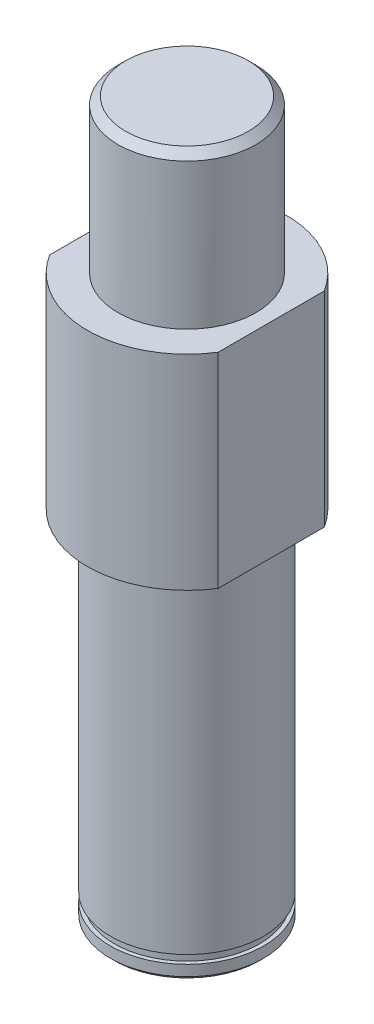
ISO-10303-21;
HEADER;
FILE_DESCRIPTION(('STEP AP214'),'2;1');
FILE_NAME('part.step','',(''),(''),'','','');
FILE_SCHEMA(('AUTOMOTIVE_DESIGN { 1 0 10303 214 1 1 1 1 }'));
ENDSEC;
DATA;
#1=APPLICATION_CONTEXT('core data for automotive mechanical design processes');
#2=APPLICATION_PROTOCOL_DEFINITION('international standard','automotive_design',2000,#1);
#3=PRODUCT_CONTEXT('',#1,'mechanical');
#4=PRODUCT('Part','Part','',(#3));
#5=PRODUCT_RELATED_PRODUCT_CATEGORY('part','',(#4));
#6=PRODUCT_DEFINITION_FORMATION('','',#4);
#7=PRODUCT_DEFINITION_CONTEXT('part definition',#1,'design');
#8=PRODUCT_DEFINITION('design','',#6,#7);
#9=PRODUCT_DEFINITION_SHAPE('','',#8);
#10=(LENGTH_UNIT() NAMED_UNIT(*) SI_UNIT(.MILLI.,.METRE.));
#11=(NAMED_UNIT(*) PLANE_ANGLE_UNIT() SI_UNIT($,.RADIAN.));
#12=(NAMED_UNIT(*) SI_UNIT($,.STERADIAN.) SOLID_ANGLE_UNIT());
#13=UNCERTAINTY_MEASURE_WITH_UNIT(LENGTH_MEASURE(1.E-05),#10,'distance_accuracy_value','');
#14=(GEOMETRIC_REPRESENTATION_CONTEXT(3) GLOBAL_UNCERTAINTY_ASSIGNED_CONTEXT((#13)) GLOBAL_UNIT_ASSIGNED_CONTEXT((#10,
#11,#12)) REPRESENTATION_CONTEXT('',''));
#15=CARTESIAN_POINT('',(0.,0.,0.));
#16=DIRECTION('',(0.,0.,1.));
#17=DIRECTION('',(1.,0.,0.));
#18=AXIS2_PLACEMENT_3D('',#15,#16,#17);
#19=CARTESIAN_POINT('',(0.,0.,0.));
#20=DIRECTION('',(0.,-1.,0.));
#21=DIRECTION('',(0.,0.,-1.));
#22=AXIS2_PLACEMENT_3D('',#19,#20,#21);
#23=PLANE('',#22);
#24=CARTESIAN_POINT('',(0.,0.,0.));
#25=DIRECTION('',(0.,-1.,0.));
#26=DIRECTION('',(0.,0.,-1.));
#27=AXIS2_PLACEMENT_3D('',#24,#25,#26);
#28=CIRCLE('',#27,9.49999999999999);
#29=CARTESIAN_POINT('',(0.,0.,-9.49999999999999));
#30=VERTEX_POINT('',#29);
#31=EDGE_CURVE('E47',#30,#30,#28,.T.);
#32=ORIENTED_EDGE('',*,*,#31,.T.);
#33=EDGE_LOOP('',(#32));
#34=FACE_BOUND('',#33,.T.);
#35=CARTESIAN_POINT('',(0.,0.,0.));
#36=DIRECTION('',(0.,-1.,0.));
#37=DIRECTION('',(0.,0.,-1.));
#38=AXIS2_PLACEMENT_3D('',#35,#36,#37);
#39=CIRCLE('',#38,4.25);
#40=CARTESIAN_POINT('',(0.,0.,-4.25));
#41=VERTEX_POINT('',#40);
#42=EDGE_CURVE('E93',#41,#41,#39,.T.);
#43=ORIENTED_EDGE('',*,*,#42,.F.);
#44=EDGE_LOOP('',(#43));
#45=FACE_BOUND('',#44,.T.);
#46=ADVANCED_FACE('F39',(#34,#45),#23,.T.);
#47=CARTESIAN_POINT('',(0.,0.,0.));
#48=DIRECTION('',(0.,-1.,0.));
#49=DIRECTION('',(0.,0.,-1.));
#50=AXIS2_PLACEMENT_3D('',#47,#48,#49);
#51=CYLINDRICAL_SURFACE('',#50,10.);
#52=CARTESIAN_POINT('',(0.,0.5,0.));
#53=DIRECTION('',(0.,-1.,0.));
#54=DIRECTION('',(0.,0.,-1.));
#55=AXIS2_PLACEMENT_3D('',#52,#53,#54);
#56=CIRCLE('',#55,10.);
#57=CARTESIAN_POINT('',(0.,0.5,-10.));
#58=VERTEX_POINT('',#57);
#59=EDGE_CURVE('E11',#58,#58,#56,.F.);
#60=ORIENTED_EDGE('',*,*,#59,.T.);
#61=EDGE_LOOP('',(#60));
#62=FACE_BOUND('',#61,.T.);
#63=CARTESIAN_POINT('',(0.,1.9,0.));
#64=DIRECTION('',(0.,-1.,0.));
#65=DIRECTION('',(0.,0.,-1.));
#66=AXIS2_PLACEMENT_3D('',#63,#64,#65);
#67=CIRCLE('',#66,10.);
#68=CARTESIAN_POINT('',(0.,1.9,-10.));
#69=VERTEX_POINT('',#68);
#70=EDGE_CURVE('E137',#69,#69,#67,.T.);
#71=ORIENTED_EDGE('',*,*,#70,.T.);
#72=EDGE_LOOP('',(#71));
#73=FACE_BOUND('',#72,.T.);
#74=ADVANCED_FACE('F161',(#62,#73),#51,.T.);
#75=CARTESIAN_POINT('',(10.,1.9,0.));
#76=DIRECTION('',(0.,1.,0.));
#77=DIRECTION('',(0.,0.,1.));
#78=AXIS2_PLACEMENT_3D('',#75,#76,#77);
#79=PLANE('',#78);
#80=CARTESIAN_POINT('',(0.,1.9,0.));
#81=DIRECTION('',(0.,-1.,0.));
#82=DIRECTION('',(0.,0.,-1.));
#83=AXIS2_PLACEMENT_3D('',#80,#81,#82);
#84=CIRCLE('',#83,9.5);
#85=CARTESIAN_POINT('',(0.,1.9,-9.5));
#86=VERTEX_POINT('',#85);
#87=EDGE_CURVE('E134',#86,#86,#84,.T.);
#88=ORIENTED_EDGE('',*,*,#87,.T.);
#89=EDGE_LOOP('',(#88));
#90=FACE_BOUND('',#89,.T.);
#91=ORIENTED_EDGE('',*,*,#70,.F.);
#92=EDGE_LOOP('',(#91));
#93=FACE_BOUND('',#92,.T.);
#94=ADVANCED_FACE('F166',(#90,#93),#79,.T.);
#95=CARTESIAN_POINT('',(0.,0.,0.));
#96=DIRECTION('',(0.,-1.,0.));
#97=DIRECTION('',(0.,0.,-1.));
#98=AXIS2_PLACEMENT_3D('',#95,#96,#97);
#99=CYLINDRICAL_SURFACE('',#98,9.5);
#100=CARTESIAN_POINT('',(0.,3.,0.));
#101=DIRECTION('',(0.,-1.,0.));
#102=DIRECTION('',(0.,0.,-1.));
#103=AXIS2_PLACEMENT_3D('',#100,#101,#102);
#104=CIRCLE('',#103,9.5);
#105=CARTESIAN_POINT('',(0.,3.,-9.5));
#106=VERTEX_POINT('',#105);
#107=EDGE_CURVE('E131',#106,#106,#104,.T.);
#108=ORIENTED_EDGE('',*,*,#107,.T.);
#109=EDGE_LOOP('',(#108));
#110=FACE_BOUND('',#109,.T.);
#111=ORIENTED_EDGE('',*,*,#87,.F.);
#112=EDGE_LOOP('',(#111));
#113=FACE_BOUND('',#112,.T.);
#114=ADVANCED_FACE('F212',(#110,#113),#99,.T.);
#115=CARTESIAN_POINT('',(10.,3.,0.));
#116=DIRECTION('',(0.,-1.,0.));
#117=DIRECTION('',(0.,0.,-1.));
#118=AXIS2_PLACEMENT_3D('',#115,#116,#117);
#119=PLANE('',#118);
#120=CARTESIAN_POINT('',(0.,3.,0.));
#121=DIRECTION('',(0.,-1.,0.));
#122=DIRECTION('',(0.,0.,-1.));
#123=AXIS2_PLACEMENT_3D('',#120,#121,#122);
#124=CIRCLE('',#123,10.);
#125=CARTESIAN_POINT('',(0.,3.,-10.));
#126=VERTEX_POINT('',#125);
#127=EDGE_CURVE('E128',#126,#126,#124,.T.);
#128=ORIENTED_EDGE('',*,*,#127,.T.);
#129=EDGE_LOOP('',(#128));
#130=FACE_BOUND('',#129,.T.);
#131=ORIENTED_EDGE('',*,*,#107,.F.);
#132=EDGE_LOOP('',(#131));
#133=FACE_BOUND('',#132,.T.);
#134=ADVANCED_FACE('F208',(#130,#133),#119,.T.);
#135=CARTESIAN_POINT('',(0.,0.,0.));
#136=DIRECTION('',(0.,-1.,0.));
#137=DIRECTION('',(0.,0.,-1.));
#138=AXIS2_PLACEMENT_3D('',#135,#136,#137);
#139=CYLINDRICAL_SURFACE('',#138,9.99999999999999);
#140=CARTESIAN_POINT('',(0.,46.3,0.));
#141=DIRECTION('',(0.,-1.,0.));
#142=DIRECTION('',(0.,0.,-1.));
#143=AXIS2_PLACEMENT_3D('',#140,#141,#142);
#144=CIRCLE('',#143,9.99999999999999);
#145=CARTESIAN_POINT('',(0.,46.3,-9.99999999999999));
#146=VERTEX_POINT('',#145);
#147=EDGE_CURVE('E146',#146,#146,#144,.F.);
#148=ORIENTED_EDGE('',*,*,#147,.F.);
#149=EDGE_LOOP('',(#148));
#150=FACE_BOUND('',#149,.T.);
#151=ORIENTED_EDGE('',*,*,#127,.F.);
#152=EDGE_LOOP('',(#151));
#153=FACE_BOUND('',#152,.T.);
#154=ADVANCED_FACE('F205',(#150,#153),#139,.T.);
#155=CARTESIAN_POINT('',(0.,46.3,0.));
#156=DIRECTION('',(0.,-1.,0.));
#157=DIRECTION('',(0.,0.,-1.));
#158=AXIS2_PLACEMENT_3D('',#155,#156,#157);
#159=PLANE('',#158);
#160=ORIENTED_EDGE('',*,*,#147,.T.);
#161=EDGE_LOOP('',(#160));
#162=FACE_BOUND('',#161,.T.);
#163=CARTESIAN_POINT('',(0.,46.3,0.));
#164=DIRECTION('',(0.,-1.,0.));
#165=DIRECTION('',(0.,0.,-1.));
#166=AXIS2_PLACEMENT_3D('',#163,#164,#165);
#167=CIRCLE('',#166,13.);
#168=CARTESIAN_POINT('',(-11.,46.3,-6.92820323027548));
#169=VERTEX_POINT('',#168);
#170=CARTESIAN_POINT('',(11.,46.3,-6.92820323027548));
#171=VERTEX_POINT('',#170);
#172=EDGE_CURVE('E92',#169,#171,#167,.T.);
#173=ORIENTED_EDGE('',*,*,#172,.T.);
#174=DIRECTION('',(0.,0.,1.));
#175=VECTOR('',#174,1.);
#176=CARTESIAN_POINT('',(11.,46.3,-6.92820323027548));
#177=LINE('',#176,#175);
#178=CARTESIAN_POINT('',(11.,46.3,6.92820323027548));
#179=VERTEX_POINT('',#178);
#180=EDGE_CURVE('E96',#171,#179,#177,.T.);
#181=ORIENTED_EDGE('',*,*,#180,.T.);
#182=CARTESIAN_POINT('',(0.,46.3,0.));
#183=DIRECTION('',(0.,-1.,0.));
#184=DIRECTION('',(0.,0.,-1.));
#185=AXIS2_PLACEMENT_3D('',#182,#183,#184);
#186=CIRCLE('',#185,13.);
#187=CARTESIAN_POINT('',(-11.,46.3,6.92820323027549));
#188=VERTEX_POINT('',#187);
#189=EDGE_CURVE('E103',#179,#188,#186,.T.);
#190=ORIENTED_EDGE('',*,*,#189,.T.);
#191=DIRECTION('',(0.,0.,-1.));
#192=VECTOR('',#191,1.);
#193=CARTESIAN_POINT('',(-11.,46.3,6.92820323027548));
#194=LINE('',#193,#192);
#195=EDGE_CURVE('E106',#188,#169,#194,.T.);
#196=ORIENTED_EDGE('',*,*,#195,.T.);
#197=EDGE_LOOP('',(#173,#181,#190,#196));
#198=FACE_BOUND('',#197,.T.);
#199=ADVANCED_FACE('F182',(#162,#198),#159,.T.);
#200=CARTESIAN_POINT('',(9.,93.,0.));
#201=DIRECTION('',(0.,1.,0.));
#202=DIRECTION('',(0.,0.,1.));
#203=AXIS2_PLACEMENT_3D('',#200,#201,#202);
#204=PLANE('',#203);
#205=CARTESIAN_POINT('',(0.,93.,0.));
#206=DIRECTION('',(0.,1.,0.));
#207=DIRECTION('',(0.,0.,1.));
#208=AXIS2_PLACEMENT_3D('',#205,#206,#207);
#209=CIRCLE('',#208,8.00000000000001);
#210=CARTESIAN_POINT('',(0.,93.,8.00000000000001));
#211=VERTEX_POINT('',#210);
#212=EDGE_CURVE('E143',#211,#211,#209,.T.);
#213=ORIENTED_EDGE('',*,*,#212,.T.);
#214=EDGE_LOOP('',(#213));
#215=FACE_BOUND('',#214,.T.);
#216=ADVANCED_FACE('F173',(#215),#204,.T.);
#217=CARTESIAN_POINT('',(0.,92.,0.));
#218=DIRECTION('',(0.,-1.,0.));
#219=DIRECTION('',(0.,0.,-1.));
#220=AXIS2_PLACEMENT_3D('',#217,#218,#219);
#221=CONICAL_SURFACE('',#220,9.,0.785398163397445);
#222=ORIENTED_EDGE('',*,*,#212,.F.);
#223=EDGE_LOOP('',(#222));
#224=FACE_BOUND('',#223,.T.);
#225=CARTESIAN_POINT('',(0.,92.,0.));
#226=DIRECTION('',(0.,1.,0.));
#227=DIRECTION('',(0.,0.,1.));
#228=AXIS2_PLACEMENT_3D('',#225,#226,#227);
#229=CIRCLE('',#228,9.);
#230=CARTESIAN_POINT('',(0.,92.,9.));
#231=VERTEX_POINT('',#230);
#232=EDGE_CURVE('E140',#231,#231,#229,.F.);
#233=ORIENTED_EDGE('',*,*,#232,.F.);
#234=EDGE_LOOP('',(#233));
#235=FACE_BOUND('',#234,.T.);
#236=ADVANCED_FACE('F170',(#224,#235),#221,.T.);
#237=CARTESIAN_POINT('',(0.,0.,0.));
#238=DIRECTION('',(0.,-1.,0.));
#239=DIRECTION('',(0.,0.,-1.));
#240=AXIS2_PLACEMENT_3D('',#237,#238,#239);
#241=CYLINDRICAL_SURFACE('',#240,9.);
#242=ORIENTED_EDGE('',*,*,#232,.T.);
#243=EDGE_LOOP('',(#242));
#244=FACE_BOUND('',#243,.T.);
#245=CARTESIAN_POINT('',(0.,73.,0.));
#246=DIRECTION('',(0.,-1.,0.));
#247=DIRECTION('',(0.,0.,-1.));
#248=AXIS2_PLACEMENT_3D('',#245,#246,#247);
#249=CIRCLE('',#248,9.);
#250=CARTESIAN_POINT('',(0.,73.,-9.));
#251=VERTEX_POINT('',#250);
#252=EDGE_CURVE('E120',#251,#251,#249,.T.);
#253=ORIENTED_EDGE('',*,*,#252,.F.);
#254=EDGE_LOOP('',(#253));
#255=FACE_BOUND('',#254,.T.);
#256=ADVANCED_FACE('F172',(#244,#255),#241,.T.);
#257=CARTESIAN_POINT('',(9.,73.,0.));
#258=DIRECTION('',(0.,1.,0.));
#259=DIRECTION('',(0.,0.,1.));
#260=AXIS2_PLACEMENT_3D('',#257,#258,#259);
#261=PLANE('',#260);
#262=DIRECTION('',(0.,0.,1.));
#263=VECTOR('',#262,1.);
#264=CARTESIAN_POINT('',(11.,73.,0.));
#265=LINE('',#264,#263);
#266=CARTESIAN_POINT('',(11.,73.,-6.92820323027548));
#267=VERTEX_POINT('',#266);
#268=CARTESIAN_POINT('',(11.,73.,6.92820323027548));
#269=VERTEX_POINT('',#268);
#270=EDGE_CURVE('E109',#267,#269,#265,.T.);
#271=ORIENTED_EDGE('',*,*,#270,.F.);
#272=CARTESIAN_POINT('',(0.,73.,0.));
#273=DIRECTION('',(0.,-1.,0.));
#274=DIRECTION('',(0.,0.,-1.));
#275=AXIS2_PLACEMENT_3D('',#272,#273,#274);
#276=CIRCLE('',#275,13.);
#277=CARTESIAN_POINT('',(-11.,73.,-6.92820323027548));
#278=VERTEX_POINT('',#277);
#279=EDGE_CURVE('E125',#278,#267,#276,.T.);
#280=ORIENTED_EDGE('',*,*,#279,.F.);
#281=DIRECTION('',(0.,0.,1.));
#282=VECTOR('',#281,1.);
#283=CARTESIAN_POINT('',(-11.,73.,0.));
#284=LINE('',#283,#282);
#285=CARTESIAN_POINT('',(-11.,73.,6.92820323027548));
#286=VERTEX_POINT('',#285);
#287=EDGE_CURVE('E113',#278,#286,#284,.T.);
#288=ORIENTED_EDGE('',*,*,#287,.T.);
#289=EDGE_CURVE('E62',#269,#286,#276,.T.);
#290=ORIENTED_EDGE('',*,*,#289,.F.);
#291=EDGE_LOOP('',(#271,#280,#288,#290));
#292=FACE_BOUND('',#291,.T.);
#293=ORIENTED_EDGE('',*,*,#252,.T.);
#294=EDGE_LOOP('',(#293));
#295=FACE_BOUND('',#294,.T.);
#296=ADVANCED_FACE('F179',(#292,#295),#261,.T.);
#297=CARTESIAN_POINT('',(-11.,0.,0.));
#298=DIRECTION('',(-1.,0.,0.));
#299=DIRECTION('',(0.,0.,1.));
#300=AXIS2_PLACEMENT_3D('',#297,#298,#299);
#301=PLANE('',#300);
#302=DIRECTION('',(0.,1.,0.));
#303=VECTOR('',#302,1.);
#304=CARTESIAN_POINT('',(-11.,0.,6.92820323027548));
#305=LINE('',#304,#303);
#306=EDGE_CURVE('E118',#188,#286,#305,.T.);
#307=ORIENTED_EDGE('',*,*,#306,.T.);
#308=ORIENTED_EDGE('',*,*,#287,.F.);
#309=DIRECTION('',(0.,1.,0.));
#310=VECTOR('',#309,1.);
#311=CARTESIAN_POINT('',(-11.,0.,-6.92820323027548));
#312=LINE('',#311,#310);
#313=EDGE_CURVE('E117',#169,#278,#312,.T.);
#314=ORIENTED_EDGE('',*,*,#313,.F.);
#315=ORIENTED_EDGE('',*,*,#195,.F.);
#316=EDGE_LOOP('',(#307,#308,#314,#315));
#317=FACE_BOUND('',#316,.T.);
#318=ADVANCED_FACE('F192',(#317),#301,.T.);
#319=CARTESIAN_POINT('',(11.,0.,0.));
#320=DIRECTION('',(-1.,0.,0.));
#321=DIRECTION('',(0.,0.,1.));
#322=AXIS2_PLACEMENT_3D('',#319,#320,#321);
#323=PLANE('',#322);
#324=DIRECTION('',(0.,1.,0.));
#325=VECTOR('',#324,1.);
#326=CARTESIAN_POINT('',(11.,0.,6.92820323027548));
#327=LINE('',#326,#325);
#328=EDGE_CURVE('E111',#179,#269,#327,.T.);
#329=ORIENTED_EDGE('',*,*,#328,.F.);
#330=ORIENTED_EDGE('',*,*,#180,.F.);
#331=DIRECTION('',(0.,1.,0.));
#332=VECTOR('',#331,1.);
#333=CARTESIAN_POINT('',(11.,0.,-6.92820323027548));
#334=LINE('',#333,#332);
#335=EDGE_CURVE('E54',#171,#267,#334,.T.);
#336=ORIENTED_EDGE('',*,*,#335,.T.);
#337=ORIENTED_EDGE('',*,*,#270,.T.);
#338=EDGE_LOOP('',(#329,#330,#336,#337));
#339=FACE_BOUND('',#338,.T.);
#340=ADVANCED_FACE('F198',(#339),#323,.F.);
#341=CARTESIAN_POINT('',(0.,0.,0.));
#342=DIRECTION('',(0.,-1.,0.));
#343=DIRECTION('',(0.,0.,-1.));
#344=AXIS2_PLACEMENT_3D('',#341,#342,#343);
#345=CYLINDRICAL_SURFACE('',#344,13.);
#346=ORIENTED_EDGE('',*,*,#328,.T.);
#347=ORIENTED_EDGE('',*,*,#289,.T.);
#348=ORIENTED_EDGE('',*,*,#306,.F.);
#349=ORIENTED_EDGE('',*,*,#189,.F.);
#350=EDGE_LOOP('',(#346,#347,#348,#349));
#351=FACE_BOUND('',#350,.T.);
#352=ADVANCED_FACE('F202',(#351),#345,.T.);
#353=ORIENTED_EDGE('',*,*,#335,.F.);
#354=ORIENTED_EDGE('',*,*,#172,.F.);
#355=ORIENTED_EDGE('',*,*,#313,.T.);
#356=ORIENTED_EDGE('',*,*,#279,.T.);
#357=EDGE_LOOP('',(#353,#354,#355,#356));
#358=FACE_BOUND('',#357,.T.);
#359=ADVANCED_FACE('F86',(#358),#345,.T.);
#360=CARTESIAN_POINT('',(0.,27.5,0.));
#361=DIRECTION('',(0.,-1.,0.));
#362=DIRECTION('',(0.,0.,-1.));
#363=AXIS2_PLACEMENT_3D('',#360,#361,#362);
#364=CONICAL_SURFACE('',#363,4.24999999999999,1.02974425867665);
#365=CARTESIAN_POINT('',(0.,30.0536576308671,0.));
#366=VERTEX_POINT('',#365);
#367=VERTEX_LOOP('',#366);
#368=FACE_BOUND('',#367,.T.);
#369=CARTESIAN_POINT('',(0.,27.5,0.));
#370=DIRECTION('',(0.,-1.,0.));
#371=DIRECTION('',(0.,0.,-1.));
#372=AXIS2_PLACEMENT_3D('',#369,#370,#371);
#373=CIRCLE('',#372,4.24999999999999);
#374=CARTESIAN_POINT('',(0.,27.5,-4.24999999999999));
#375=VERTEX_POINT('',#374);
#376=EDGE_CURVE('E90',#375,#375,#373,.T.);
#377=ORIENTED_EDGE('',*,*,#376,.T.);
#378=EDGE_LOOP('',(#377));
#379=FACE_BOUND('',#378,.T.);
#380=ADVANCED_FACE('F82',(#368,#379),#364,.F.);
#381=CARTESIAN_POINT('',(0.,0.,0.));
#382=DIRECTION('',(0.,-1.,0.));
#383=DIRECTION('',(0.,0.,-1.));
#384=AXIS2_PLACEMENT_3D('',#381,#382,#383);
#385=CYLINDRICAL_SURFACE('',#384,4.25);
#386=ORIENTED_EDGE('',*,*,#376,.F.);
#387=EDGE_LOOP('',(#386));
#388=FACE_BOUND('',#387,.T.);
#389=ORIENTED_EDGE('',*,*,#42,.T.);
#390=EDGE_LOOP('',(#389));
#391=FACE_BOUND('',#390,.T.);
#392=ADVANCED_FACE('F85',(#388,#391),#385,.F.);
#393=CARTESIAN_POINT('',(0.,0.,0.));
#394=DIRECTION('',(0.,1.,0.));
#395=DIRECTION('',(0.,0.,1.));
#396=AXIS2_PLACEMENT_3D('',#393,#394,#395);
#397=CONICAL_SURFACE('',#396,9.49999999999999,0.785398163397455);
#398=ORIENTED_EDGE('',*,*,#59,.F.);
#399=EDGE_LOOP('',(#398));
#400=FACE_BOUND('',#399,.T.);
#401=ORIENTED_EDGE('',*,*,#31,.F.);
#402=EDGE_LOOP('',(#401));
#403=FACE_BOUND('',#402,.T.);
#404=ADVANCED_FACE('F41',(#400,#403),#397,.T.);
#405=CLOSED_SHELL('',(#46,#74,#94,#114,#134,#154,#199,#216,#236,#256,#296,#318,#340,#352,#359,
#380,#392,#404));
#406=MANIFOLD_SOLID_BREP('B2',#405);
#407=ADVANCED_BREP_SHAPE_REPRESENTATION('',(#18,#406),#14);
#408=SHAPE_DEFINITION_REPRESENTATION(#9,#407);
ENDSEC;
END-ISO-10303-21;
